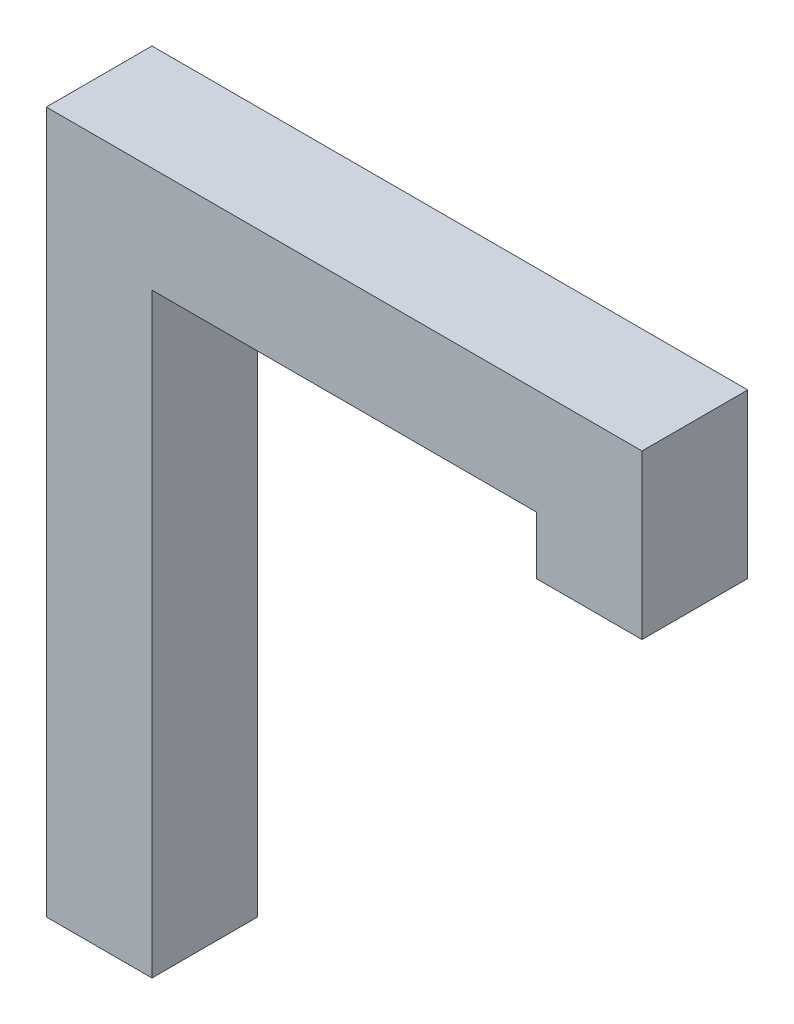
ISO-10303-21;
HEADER;
FILE_DESCRIPTION(('STEP AP214'),'2;1');
FILE_NAME('part.step','',(''),(''),'','','');
FILE_SCHEMA(('AUTOMOTIVE_DESIGN { 1 0 10303 214 1 1 1 1 }'));
ENDSEC;
DATA;
#1=APPLICATION_CONTEXT('core data for automotive mechanical design processes');
#2=APPLICATION_PROTOCOL_DEFINITION('international standard','automotive_design',2000,#1);
#3=PRODUCT_CONTEXT('',#1,'mechanical');
#4=PRODUCT('Part','Part','',(#3));
#5=PRODUCT_RELATED_PRODUCT_CATEGORY('part','',(#4));
#6=PRODUCT_DEFINITION_FORMATION('','',#4);
#7=PRODUCT_DEFINITION_CONTEXT('part definition',#1,'design');
#8=PRODUCT_DEFINITION('design','',#6,#7);
#9=PRODUCT_DEFINITION_SHAPE('','',#8);
#10=(LENGTH_UNIT() NAMED_UNIT(*) SI_UNIT(.MILLI.,.METRE.));
#11=(NAMED_UNIT(*) PLANE_ANGLE_UNIT() SI_UNIT($,.RADIAN.));
#12=(NAMED_UNIT(*) SI_UNIT($,.STERADIAN.) SOLID_ANGLE_UNIT());
#13=UNCERTAINTY_MEASURE_WITH_UNIT(LENGTH_MEASURE(1.E-05),#10,'distance_accuracy_value','');
#14=(GEOMETRIC_REPRESENTATION_CONTEXT(3) GLOBAL_UNCERTAINTY_ASSIGNED_CONTEXT((#13)) GLOBAL_UNIT_ASSIGNED_CONTEXT((#10,
#11,#12)) REPRESENTATION_CONTEXT('',''));
#15=CARTESIAN_POINT('',(0.,0.,0.));
#16=DIRECTION('',(0.,0.,1.));
#17=DIRECTION('',(1.,0.,0.));
#18=AXIS2_PLACEMENT_3D('',#15,#16,#17);
#19=CARTESIAN_POINT('',(0.,31.,5.5));
#20=DIRECTION('',(-1.,0.,0.));
#21=DIRECTION('',(0.,-1.,0.));
#22=AXIS2_PLACEMENT_3D('',#19,#20,#21);
#23=PLANE('',#22);
#24=DIRECTION('',(0.,1.,0.));
#25=VECTOR('',#24,1.);
#26=CARTESIAN_POINT('',(0.,31.,0.));
#27=LINE('',#26,#25);
#28=CARTESIAN_POINT('',(0.,0.,0.));
#29=VERTEX_POINT('',#28);
#30=CARTESIAN_POINT('',(0.,31.,0.));
#31=VERTEX_POINT('',#30);
#32=EDGE_CURVE('E129',#29,#31,#27,.T.);
#33=ORIENTED_EDGE('',*,*,#32,.T.);
#34=DIRECTION('',(0.,0.,-1.));
#35=VECTOR('',#34,1.);
#36=CARTESIAN_POINT('',(0.,31.,5.5));
#37=LINE('',#36,#35);
#38=CARTESIAN_POINT('',(0.,31.,5.5));
#39=VERTEX_POINT('',#38);
#40=EDGE_CURVE('E11',#39,#31,#37,.T.);
#41=ORIENTED_EDGE('',*,*,#40,.F.);
#42=DIRECTION('',(0.,1.,0.));
#43=VECTOR('',#42,1.);
#44=CARTESIAN_POINT('',(0.,31.,5.5));
#45=LINE('',#44,#43);
#46=CARTESIAN_POINT('',(0.,0.,5.5));
#47=VERTEX_POINT('',#46);
#48=EDGE_CURVE('E143',#47,#39,#45,.T.);
#49=ORIENTED_EDGE('',*,*,#48,.F.);
#50=DIRECTION('',(0.,0.,-1.));
#51=VECTOR('',#50,1.);
#52=CARTESIAN_POINT('',(0.,0.,5.5));
#53=LINE('',#52,#51);
#54=EDGE_CURVE('E125',#47,#29,#53,.T.);
#55=ORIENTED_EDGE('',*,*,#54,.T.);
#56=EDGE_LOOP('',(#33,#41,#49,#55));
#57=FACE_BOUND('',#56,.T.);
#58=ADVANCED_FACE('F33',(#57),#23,.F.);
#59=CARTESIAN_POINT('',(20.,31.,5.5));
#60=DIRECTION('',(0.,1.,0.));
#61=DIRECTION('',(-1.,0.,0.));
#62=AXIS2_PLACEMENT_3D('',#59,#60,#61);
#63=PLANE('',#62);
#64=DIRECTION('',(1.,0.,0.));
#65=VECTOR('',#64,1.);
#66=CARTESIAN_POINT('',(20.,31.,0.));
#67=LINE('',#66,#65);
#68=CARTESIAN_POINT('',(20.,31.,0.));
#69=VERTEX_POINT('',#68);
#70=EDGE_CURVE('E132',#31,#69,#67,.T.);
#71=ORIENTED_EDGE('',*,*,#70,.T.);
#72=DIRECTION('',(0.,0.,-1.));
#73=VECTOR('',#72,1.);
#74=CARTESIAN_POINT('',(20.,31.,5.5));
#75=LINE('',#74,#73);
#76=CARTESIAN_POINT('',(20.,31.,5.5));
#77=VERTEX_POINT('',#76);
#78=EDGE_CURVE('E41',#77,#69,#75,.T.);
#79=ORIENTED_EDGE('',*,*,#78,.F.);
#80=DIRECTION('',(1.,0.,0.));
#81=VECTOR('',#80,1.);
#82=CARTESIAN_POINT('',(20.,31.,5.5));
#83=LINE('',#82,#81);
#84=EDGE_CURVE('E92',#39,#77,#83,.T.);
#85=ORIENTED_EDGE('',*,*,#84,.F.);
#86=ORIENTED_EDGE('',*,*,#40,.T.);
#87=EDGE_LOOP('',(#71,#79,#85,#86));
#88=FACE_BOUND('',#87,.T.);
#89=ADVANCED_FACE('F178',(#88),#63,.F.);
#90=CARTESIAN_POINT('',(20.,28.,5.5));
#91=DIRECTION('',(1.,0.,0.));
#92=DIRECTION('',(0.,0.,-1.));
#93=AXIS2_PLACEMENT_3D('',#90,#91,#92);
#94=PLANE('',#93);
#95=DIRECTION('',(0.,-1.,0.));
#96=VECTOR('',#95,1.);
#97=CARTESIAN_POINT('',(20.,28.,0.));
#98=LINE('',#97,#96);
#99=CARTESIAN_POINT('',(20.,28.,0.));
#100=VERTEX_POINT('',#99);
#101=EDGE_CURVE('E134',#69,#100,#98,.T.);
#102=ORIENTED_EDGE('',*,*,#101,.T.);
#103=DIRECTION('',(0.,0.,-1.));
#104=VECTOR('',#103,1.);
#105=CARTESIAN_POINT('',(20.,28.,5.5));
#106=LINE('',#105,#104);
#107=CARTESIAN_POINT('',(20.,28.,5.5));
#108=VERTEX_POINT('',#107);
#109=EDGE_CURVE('E150',#108,#100,#106,.T.);
#110=ORIENTED_EDGE('',*,*,#109,.F.);
#111=DIRECTION('',(0.,-1.,0.));
#112=VECTOR('',#111,1.);
#113=CARTESIAN_POINT('',(20.,28.,5.5));
#114=LINE('',#113,#112);
#115=EDGE_CURVE('E158',#77,#108,#114,.T.);
#116=ORIENTED_EDGE('',*,*,#115,.F.);
#117=ORIENTED_EDGE('',*,*,#78,.T.);
#118=EDGE_LOOP('',(#102,#110,#116,#117));
#119=FACE_BOUND('',#118,.T.);
#120=ADVANCED_FACE('F156',(#119),#94,.F.);
#121=CARTESIAN_POINT('',(25.5,28.,5.5));
#122=DIRECTION('',(0.,1.,0.));
#123=DIRECTION('',(0.,0.,1.));
#124=AXIS2_PLACEMENT_3D('',#121,#122,#123);
#125=PLANE('',#124);
#126=DIRECTION('',(1.,0.,0.));
#127=VECTOR('',#126,1.);
#128=CARTESIAN_POINT('',(25.5,28.,0.));
#129=LINE('',#128,#127);
#130=CARTESIAN_POINT('',(25.5,28.,0.));
#131=VERTEX_POINT('',#130);
#132=EDGE_CURVE('E136',#100,#131,#129,.T.);
#133=ORIENTED_EDGE('',*,*,#132,.T.);
#134=DIRECTION('',(0.,0.,-1.));
#135=VECTOR('',#134,1.);
#136=CARTESIAN_POINT('',(25.5,28.,5.5));
#137=LINE('',#136,#135);
#138=CARTESIAN_POINT('',(25.5,28.,5.5));
#139=VERTEX_POINT('',#138);
#140=EDGE_CURVE('E147',#139,#131,#137,.T.);
#141=ORIENTED_EDGE('',*,*,#140,.F.);
#142=DIRECTION('',(1.,0.,0.));
#143=VECTOR('',#142,1.);
#144=CARTESIAN_POINT('',(25.5,28.,5.5));
#145=LINE('',#144,#143);
#146=EDGE_CURVE('E170',#108,#139,#145,.T.);
#147=ORIENTED_EDGE('',*,*,#146,.F.);
#148=ORIENTED_EDGE('',*,*,#109,.T.);
#149=EDGE_LOOP('',(#133,#141,#147,#148));
#150=FACE_BOUND('',#149,.T.);
#151=ADVANCED_FACE('F166',(#150),#125,.F.);
#152=CARTESIAN_POINT('',(25.5,36.5,5.5));
#153=DIRECTION('',(-1.,0.,0.));
#154=DIRECTION('',(0.,0.,1.));
#155=AXIS2_PLACEMENT_3D('',#152,#153,#154);
#156=PLANE('',#155);
#157=DIRECTION('',(0.,1.,0.));
#158=VECTOR('',#157,1.);
#159=CARTESIAN_POINT('',(25.5,36.5,0.));
#160=LINE('',#159,#158);
#161=CARTESIAN_POINT('',(25.5,36.5,0.));
#162=VERTEX_POINT('',#161);
#163=EDGE_CURVE('E138',#131,#162,#160,.T.);
#164=ORIENTED_EDGE('',*,*,#163,.T.);
#165=DIRECTION('',(0.,0.,-1.));
#166=VECTOR('',#165,1.);
#167=CARTESIAN_POINT('',(25.5,36.5,5.5));
#168=LINE('',#167,#166);
#169=CARTESIAN_POINT('',(25.5,36.5,5.5));
#170=VERTEX_POINT('',#169);
#171=EDGE_CURVE('E120',#170,#162,#168,.T.);
#172=ORIENTED_EDGE('',*,*,#171,.F.);
#173=DIRECTION('',(0.,1.,0.));
#174=VECTOR('',#173,1.);
#175=CARTESIAN_POINT('',(25.5,36.5,5.5));
#176=LINE('',#175,#174);
#177=EDGE_CURVE('E111',#139,#170,#176,.T.);
#178=ORIENTED_EDGE('',*,*,#177,.F.);
#179=ORIENTED_EDGE('',*,*,#140,.T.);
#180=EDGE_LOOP('',(#164,#172,#178,#179));
#181=FACE_BOUND('',#180,.T.);
#182=ADVANCED_FACE('F169',(#181),#156,.F.);
#183=CARTESIAN_POINT('',(-5.5,36.5,5.5));
#184=DIRECTION('',(0.,-1.,0.));
#185=DIRECTION('',(1.,0.,0.));
#186=AXIS2_PLACEMENT_3D('',#183,#184,#185);
#187=PLANE('',#186);
#188=DIRECTION('',(-1.,0.,0.));
#189=VECTOR('',#188,1.);
#190=CARTESIAN_POINT('',(-5.5,36.5,0.));
#191=LINE('',#190,#189);
#192=CARTESIAN_POINT('',(-5.5,36.5,0.));
#193=VERTEX_POINT('',#192);
#194=EDGE_CURVE('E119',#162,#193,#191,.T.);
#195=ORIENTED_EDGE('',*,*,#194,.T.);
#196=DIRECTION('',(0.,0.,-1.));
#197=VECTOR('',#196,1.);
#198=CARTESIAN_POINT('',(-5.5,36.5,5.5));
#199=LINE('',#198,#197);
#200=CARTESIAN_POINT('',(-5.5,36.5,5.5));
#201=VERTEX_POINT('',#200);
#202=EDGE_CURVE('E116',#201,#193,#199,.T.);
#203=ORIENTED_EDGE('',*,*,#202,.F.);
#204=DIRECTION('',(-1.,0.,0.));
#205=VECTOR('',#204,1.);
#206=CARTESIAN_POINT('',(-5.5,36.5,5.5));
#207=LINE('',#206,#205);
#208=EDGE_CURVE('E105',#170,#201,#207,.T.);
#209=ORIENTED_EDGE('',*,*,#208,.F.);
#210=ORIENTED_EDGE('',*,*,#171,.T.);
#211=EDGE_LOOP('',(#195,#203,#209,#210));
#212=FACE_BOUND('',#211,.T.);
#213=ADVANCED_FACE('F117',(#212),#187,.F.);
#214=CARTESIAN_POINT('',(-5.5,0.,5.5));
#215=DIRECTION('',(1.,0.,0.));
#216=DIRECTION('',(0.,0.,-1.));
#217=AXIS2_PLACEMENT_3D('',#214,#215,#216);
#218=PLANE('',#217);
#219=DIRECTION('',(0.,-1.,0.));
#220=VECTOR('',#219,1.);
#221=CARTESIAN_POINT('',(-5.5,0.,0.));
#222=LINE('',#221,#220);
#223=CARTESIAN_POINT('',(-5.5,0.,0.));
#224=VERTEX_POINT('',#223);
#225=EDGE_CURVE('E78',#193,#224,#222,.T.);
#226=ORIENTED_EDGE('',*,*,#225,.T.);
#227=DIRECTION('',(0.,0.,-1.));
#228=VECTOR('',#227,1.);
#229=CARTESIAN_POINT('',(-5.5,0.,5.5));
#230=LINE('',#229,#228);
#231=CARTESIAN_POINT('',(-5.5,0.,5.5));
#232=VERTEX_POINT('',#231);
#233=EDGE_CURVE('E121',#232,#224,#230,.T.);
#234=ORIENTED_EDGE('',*,*,#233,.F.);
#235=DIRECTION('',(0.,-1.,0.));
#236=VECTOR('',#235,1.);
#237=CARTESIAN_POINT('',(-5.5,0.,5.5));
#238=LINE('',#237,#236);
#239=EDGE_CURVE('E109',#201,#232,#238,.T.);
#240=ORIENTED_EDGE('',*,*,#239,.F.);
#241=ORIENTED_EDGE('',*,*,#202,.T.);
#242=EDGE_LOOP('',(#226,#234,#240,#241));
#243=FACE_BOUND('',#242,.T.);
#244=ADVANCED_FACE('F123',(#243),#218,.F.);
#245=CARTESIAN_POINT('',(0.,0.,5.5));
#246=DIRECTION('',(0.,1.,0.));
#247=DIRECTION('',(0.,0.,1.));
#248=AXIS2_PLACEMENT_3D('',#245,#246,#247);
#249=PLANE('',#248);
#250=DIRECTION('',(1.,0.,0.));
#251=VECTOR('',#250,1.);
#252=CARTESIAN_POINT('',(0.,0.,0.));
#253=LINE('',#252,#251);
#254=EDGE_CURVE('E84',#224,#29,#253,.T.);
#255=ORIENTED_EDGE('',*,*,#254,.T.);
#256=ORIENTED_EDGE('',*,*,#54,.F.);
#257=DIRECTION('',(1.,0.,0.));
#258=VECTOR('',#257,1.);
#259=CARTESIAN_POINT('',(0.,0.,5.5));
#260=LINE('',#259,#258);
#261=EDGE_CURVE('E49',#232,#47,#260,.T.);
#262=ORIENTED_EDGE('',*,*,#261,.F.);
#263=ORIENTED_EDGE('',*,*,#233,.T.);
#264=EDGE_LOOP('',(#255,#256,#262,#263));
#265=FACE_BOUND('',#264,.T.);
#266=ADVANCED_FACE('F194',(#265),#249,.F.);
#267=CARTESIAN_POINT('',(0.,0.,5.5));
#268=DIRECTION('',(0.,0.,-1.));
#269=DIRECTION('',(-1.,0.,0.));
#270=AXIS2_PLACEMENT_3D('',#267,#268,#269);
#271=PLANE('',#270);
#272=ORIENTED_EDGE('',*,*,#48,.T.);
#273=ORIENTED_EDGE('',*,*,#84,.T.);
#274=ORIENTED_EDGE('',*,*,#115,.T.);
#275=ORIENTED_EDGE('',*,*,#146,.T.);
#276=ORIENTED_EDGE('',*,*,#177,.T.);
#277=ORIENTED_EDGE('',*,*,#208,.T.);
#278=ORIENTED_EDGE('',*,*,#239,.T.);
#279=ORIENTED_EDGE('',*,*,#261,.T.);
#280=EDGE_LOOP('',(#272,#273,#274,#275,#276,#277,#278,#279));
#281=FACE_BOUND('',#280,.T.);
#282=ADVANCED_FACE('F107',(#281),#271,.F.);
#283=CARTESIAN_POINT('',(0.,0.,0.));
#284=DIRECTION('',(0.,0.,-1.));
#285=DIRECTION('',(-1.,0.,0.));
#286=AXIS2_PLACEMENT_3D('',#283,#284,#285);
#287=PLANE('',#286);
#288=ORIENTED_EDGE('',*,*,#32,.F.);
#289=ORIENTED_EDGE('',*,*,#254,.F.);
#290=ORIENTED_EDGE('',*,*,#225,.F.);
#291=ORIENTED_EDGE('',*,*,#194,.F.);
#292=ORIENTED_EDGE('',*,*,#163,.F.);
#293=ORIENTED_EDGE('',*,*,#132,.F.);
#294=ORIENTED_EDGE('',*,*,#101,.F.);
#295=ORIENTED_EDGE('',*,*,#70,.F.);
#296=EDGE_LOOP('',(#288,#289,#290,#291,#292,#293,#294,#295));
#297=FACE_BOUND('',#296,.T.);
#298=ADVANCED_FACE('F162',(#297),#287,.T.);
#299=CLOSED_SHELL('',(#58,#89,#120,#151,#182,#213,#244,#266,#282,#298));
#300=MANIFOLD_SOLID_BREP('B2',#299);
#301=ADVANCED_BREP_SHAPE_REPRESENTATION('',(#18,#300),#14);
#302=SHAPE_DEFINITION_REPRESENTATION(#9,#301);
ENDSEC;
END-ISO-10303-21;
